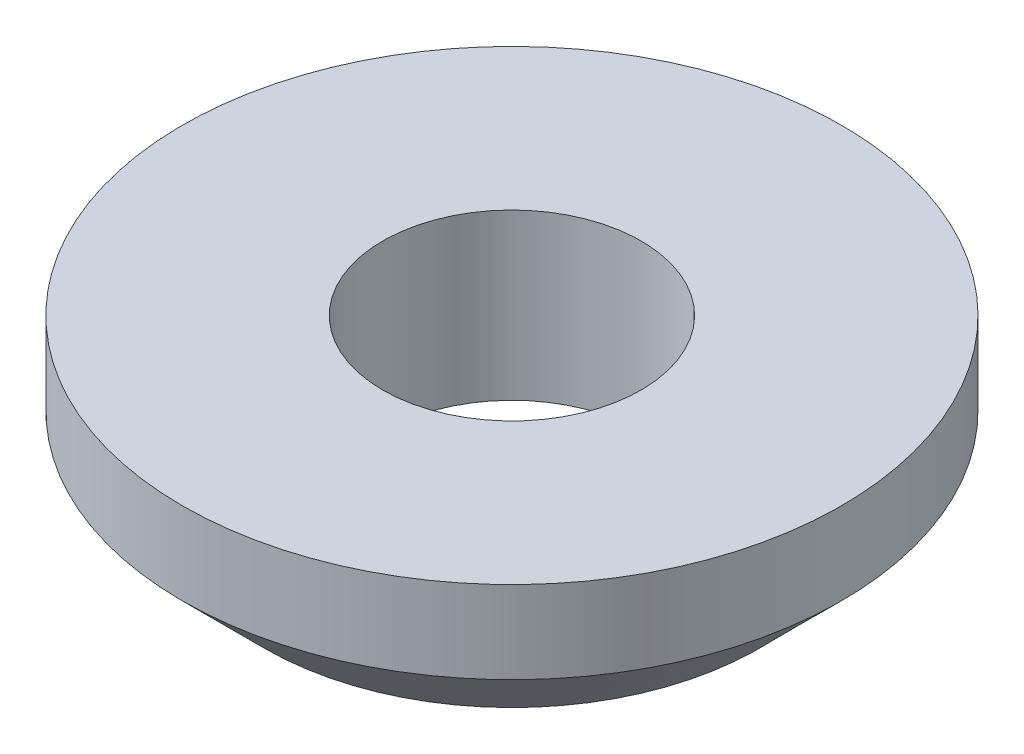
ISO-10303-21;
HEADER;
FILE_DESCRIPTION(('STEP AP214'),'2;1');
FILE_NAME('part.step','',(''),(''),'','','');
FILE_SCHEMA(('AUTOMOTIVE_DESIGN { 1 0 10303 214 1 1 1 1 }'));
ENDSEC;
DATA;
#1=APPLICATION_CONTEXT('core data for automotive mechanical design processes');
#2=APPLICATION_PROTOCOL_DEFINITION('international standard','automotive_design',2000,#1);
#3=PRODUCT_CONTEXT('',#1,'mechanical');
#4=PRODUCT('Part','Part','',(#3));
#5=PRODUCT_RELATED_PRODUCT_CATEGORY('part','',(#4));
#6=PRODUCT_DEFINITION_FORMATION('','',#4);
#7=PRODUCT_DEFINITION_CONTEXT('part definition',#1,'design');
#8=PRODUCT_DEFINITION('design','',#6,#7);
#9=PRODUCT_DEFINITION_SHAPE('','',#8);
#10=(LENGTH_UNIT() NAMED_UNIT(*) SI_UNIT(.MILLI.,.METRE.));
#11=(NAMED_UNIT(*) PLANE_ANGLE_UNIT() SI_UNIT($,.RADIAN.));
#12=(NAMED_UNIT(*) SI_UNIT($,.STERADIAN.) SOLID_ANGLE_UNIT());
#13=UNCERTAINTY_MEASURE_WITH_UNIT(LENGTH_MEASURE(1.E-05),#10,'distance_accuracy_value','');
#14=(GEOMETRIC_REPRESENTATION_CONTEXT(3) GLOBAL_UNCERTAINTY_ASSIGNED_CONTEXT((#13)) GLOBAL_UNIT_ASSIGNED_CONTEXT((#10,
#11,#12)) REPRESENTATION_CONTEXT('',''));
#15=CARTESIAN_POINT('',(0.,0.,0.));
#16=DIRECTION('',(0.,0.,1.));
#17=DIRECTION('',(1.,0.,0.));
#18=AXIS2_PLACEMENT_3D('',#15,#16,#17);
#19=CARTESIAN_POINT('',(0.,1.5875,0.));
#20=DIRECTION('',(0.,1.,0.));
#21=DIRECTION('',(0.,0.,1.));
#22=AXIS2_PLACEMENT_3D('',#19,#20,#21);
#23=PLANE('',#22);
#24=CARTESIAN_POINT('',(0.,1.5875,0.));
#25=DIRECTION('',(0.,1.,0.));
#26=DIRECTION('',(0.,0.,1.));
#27=AXIS2_PLACEMENT_3D('',#24,#25,#26);
#28=CIRCLE('',#27,6.35);
#29=CARTESIAN_POINT('',(0.,1.5875,6.35));
#30=VERTEX_POINT('',#29);
#31=EDGE_CURVE('E49',#30,#30,#28,.T.);
#32=ORIENTED_EDGE('',*,*,#31,.T.);
#33=EDGE_LOOP('',(#32));
#34=FACE_BOUND('',#33,.T.);
#35=CARTESIAN_POINT('',(0.,1.5875,0.));
#36=DIRECTION('',(0.,1.,0.));
#37=DIRECTION('',(0.,0.,1.));
#38=AXIS2_PLACEMENT_3D('',#35,#36,#37);
#39=CIRCLE('',#38,2.4892);
#40=CARTESIAN_POINT('',(0.,1.5875,2.4892));
#41=VERTEX_POINT('',#40);
#42=EDGE_CURVE('E54',#41,#41,#39,.T.);
#43=ORIENTED_EDGE('',*,*,#42,.F.);
#44=EDGE_LOOP('',(#43));
#45=FACE_BOUND('',#44,.T.);
#46=ADVANCED_FACE('F36',(#34,#45),#23,.T.);
#47=CARTESIAN_POINT('',(0.,-1.5875,0.));
#48=DIRECTION('',(0.,1.,0.));
#49=DIRECTION('',(0.,0.,1.));
#50=AXIS2_PLACEMENT_3D('',#47,#48,#49);
#51=PLANE('',#50);
#52=CARTESIAN_POINT('',(0.,-1.5875,0.));
#53=DIRECTION('',(0.,1.,0.));
#54=DIRECTION('',(0.,0.,1.));
#55=AXIS2_PLACEMENT_3D('',#52,#53,#54);
#56=CIRCLE('',#55,4.7625);
#57=CARTESIAN_POINT('',(0.,-1.5875,4.7625));
#58=VERTEX_POINT('',#57);
#59=EDGE_CURVE('E10',#58,#58,#56,.F.);
#60=ORIENTED_EDGE('',*,*,#59,.T.);
#61=EDGE_LOOP('',(#60));
#62=FACE_BOUND('',#61,.T.);
#63=CARTESIAN_POINT('',(0.,-1.5875,0.));
#64=DIRECTION('',(0.,1.,0.));
#65=DIRECTION('',(0.,0.,1.));
#66=AXIS2_PLACEMENT_3D('',#63,#64,#65);
#67=CIRCLE('',#66,2.4892);
#68=CARTESIAN_POINT('',(0.,-1.5875,2.4892));
#69=VERTEX_POINT('',#68);
#70=EDGE_CURVE('E57',#69,#69,#67,.T.);
#71=ORIENTED_EDGE('',*,*,#70,.T.);
#72=EDGE_LOOP('',(#71));
#73=FACE_BOUND('',#72,.T.);
#74=ADVANCED_FACE('F69',(#62,#73),#51,.F.);
#75=CARTESIAN_POINT('',(0.,1.5875,0.));
#76=DIRECTION('',(0.,-1.,0.));
#77=DIRECTION('',(0.,0.,-1.));
#78=AXIS2_PLACEMENT_3D('',#75,#76,#77);
#79=CYLINDRICAL_SURFACE('',#78,6.35);
#80=CARTESIAN_POINT('',(0.,0.,0.));
#81=DIRECTION('',(0.,1.,0.));
#82=DIRECTION('',(0.,0.,1.));
#83=AXIS2_PLACEMENT_3D('',#80,#81,#82);
#84=CIRCLE('',#83,6.35);
#85=CARTESIAN_POINT('',(0.,0.,6.35));
#86=VERTEX_POINT('',#85);
#87=EDGE_CURVE('E44',#86,#86,#84,.T.);
#88=ORIENTED_EDGE('',*,*,#87,.T.);
#89=EDGE_LOOP('',(#88));
#90=FACE_BOUND('',#89,.T.);
#91=ORIENTED_EDGE('',*,*,#31,.F.);
#92=EDGE_LOOP('',(#91));
#93=FACE_BOUND('',#92,.T.);
#94=ADVANCED_FACE('F76',(#90,#93),#79,.T.);
#95=CARTESIAN_POINT('',(0.,1.5875,0.));
#96=DIRECTION('',(0.,-1.,0.));
#97=DIRECTION('',(0.,0.,-1.));
#98=AXIS2_PLACEMENT_3D('',#95,#96,#97);
#99=CYLINDRICAL_SURFACE('',#98,2.4892);
#100=ORIENTED_EDGE('',*,*,#42,.T.);
#101=EDGE_LOOP('',(#100));
#102=FACE_BOUND('',#101,.T.);
#103=ORIENTED_EDGE('',*,*,#70,.F.);
#104=EDGE_LOOP('',(#103));
#105=FACE_BOUND('',#104,.T.);
#106=ADVANCED_FACE('F65',(#102,#105),#99,.F.);
#107=CARTESIAN_POINT('',(0.,0.,0.));
#108=DIRECTION('',(0.,1.,0.));
#109=DIRECTION('',(0.,0.,1.));
#110=AXIS2_PLACEMENT_3D('',#107,#108,#109);
#111=CONICAL_SURFACE('',#110,6.35,0.78539816339745);
#112=ORIENTED_EDGE('',*,*,#59,.F.);
#113=EDGE_LOOP('',(#112));
#114=FACE_BOUND('',#113,.T.);
#115=ORIENTED_EDGE('',*,*,#87,.F.);
#116=EDGE_LOOP('',(#115));
#117=FACE_BOUND('',#116,.T.);
#118=ADVANCED_FACE('F38',(#114,#117),#111,.T.);
#119=CLOSED_SHELL('',(#46,#74,#94,#106,#118));
#120=MANIFOLD_SOLID_BREP('B2',#119);
#121=ADVANCED_BREP_SHAPE_REPRESENTATION('',(#18,#120),#14);
#122=SHAPE_DEFINITION_REPRESENTATION(#9,#121);
ENDSEC;
END-ISO-10303-21;
